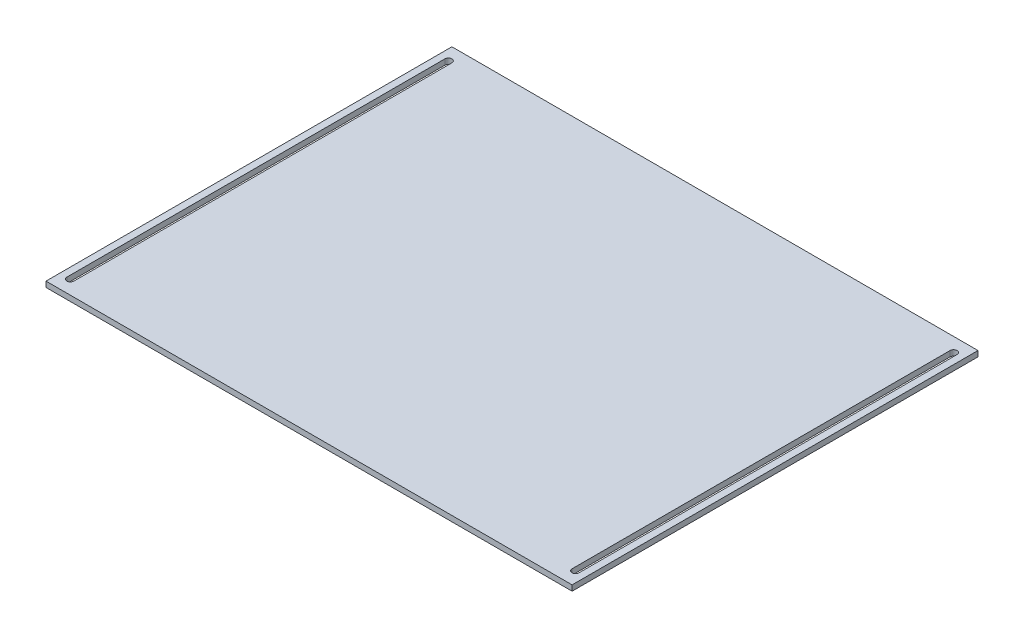
ISO-10303-21;
HEADER;
FILE_DESCRIPTION(('STEP AP214'),'2;1');
FILE_NAME('part.step','',(''),(''),'','','');
FILE_SCHEMA(('AUTOMOTIVE_DESIGN { 1 0 10303 214 1 1 1 1 }'));
ENDSEC;
DATA;
#1=APPLICATION_CONTEXT('core data for automotive mechanical design processes');
#2=APPLICATION_PROTOCOL_DEFINITION('international standard','automotive_design',2000,#1);
#3=PRODUCT_CONTEXT('',#1,'mechanical');
#4=PRODUCT('Part','Part','',(#3));
#5=PRODUCT_RELATED_PRODUCT_CATEGORY('part','',(#4));
#6=PRODUCT_DEFINITION_FORMATION('','',#4);
#7=PRODUCT_DEFINITION_CONTEXT('part definition',#1,'design');
#8=PRODUCT_DEFINITION('design','',#6,#7);
#9=PRODUCT_DEFINITION_SHAPE('','',#8);
#10=(LENGTH_UNIT() NAMED_UNIT(*) SI_UNIT(.MILLI.,.METRE.));
#11=(NAMED_UNIT(*) PLANE_ANGLE_UNIT() SI_UNIT($,.RADIAN.));
#12=(NAMED_UNIT(*) SI_UNIT($,.STERADIAN.) SOLID_ANGLE_UNIT());
#13=UNCERTAINTY_MEASURE_WITH_UNIT(LENGTH_MEASURE(1.E-05),#10,'distance_accuracy_value','');
#14=(GEOMETRIC_REPRESENTATION_CONTEXT(3) GLOBAL_UNCERTAINTY_ASSIGNED_CONTEXT((#13)) GLOBAL_UNIT_ASSIGNED_CONTEXT((#10,
#11,#12)) REPRESENTATION_CONTEXT('',''));
#15=CARTESIAN_POINT('',(0.,0.,0.));
#16=DIRECTION('',(0.,0.,1.));
#17=DIRECTION('',(1.,0.,0.));
#18=AXIS2_PLACEMENT_3D('',#15,#16,#17);
#19=CARTESIAN_POINT('',(0.,3.175,0.));
#20=DIRECTION('',(-1.,0.,0.));
#21=DIRECTION('',(0.,0.,1.));
#22=AXIS2_PLACEMENT_3D('',#19,#20,#21);
#23=PLANE('',#22);
#24=DIRECTION('',(0.,0.,-1.));
#25=VECTOR('',#24,1.);
#26=CARTESIAN_POINT('',(0.,0.,0.));
#27=LINE('',#26,#25);
#28=CARTESIAN_POINT('',(0.,0.,0.));
#29=VERTEX_POINT('',#28);
#30=CARTESIAN_POINT('',(0.,0.,-233.));
#31=VERTEX_POINT('',#30);
#32=EDGE_CURVE('E180',#29,#31,#27,.T.);
#33=ORIENTED_EDGE('',*,*,#32,.T.);
#34=DIRECTION('',(0.,-1.,0.));
#35=VECTOR('',#34,1.);
#36=CARTESIAN_POINT('',(0.,3.175,-233.));
#37=LINE('',#36,#35);
#38=CARTESIAN_POINT('',(0.,3.175,-233.));
#39=VERTEX_POINT('',#38);
#40=EDGE_CURVE('E11',#39,#31,#37,.T.);
#41=ORIENTED_EDGE('',*,*,#40,.F.);
#42=DIRECTION('',(0.,0.,-1.));
#43=VECTOR('',#42,1.);
#44=CARTESIAN_POINT('',(0.,3.175,0.));
#45=LINE('',#44,#43);
#46=CARTESIAN_POINT('',(0.,3.175,0.));
#47=VERTEX_POINT('',#46);
#48=EDGE_CURVE('E228',#47,#39,#45,.T.);
#49=ORIENTED_EDGE('',*,*,#48,.F.);
#50=DIRECTION('',(0.,-1.,0.));
#51=VECTOR('',#50,1.);
#52=CARTESIAN_POINT('',(0.,3.175,0.));
#53=LINE('',#52,#51);
#54=EDGE_CURVE('E242',#47,#29,#53,.T.);
#55=ORIENTED_EDGE('',*,*,#54,.T.);
#56=EDGE_LOOP('',(#33,#41,#49,#55));
#57=FACE_BOUND('',#56,.T.);
#58=ADVANCED_FACE('F45',(#57),#23,.F.);
#59=CARTESIAN_POINT('',(0.,3.175,-233.));
#60=DIRECTION('',(0.,0.,1.));
#61=DIRECTION('',(1.,0.,0.));
#62=AXIS2_PLACEMENT_3D('',#59,#60,#61);
#63=PLANE('',#62);
#64=DIRECTION('',(-1.,0.,0.));
#65=VECTOR('',#64,1.);
#66=CARTESIAN_POINT('',(0.,0.,-233.));
#67=LINE('',#66,#65);
#68=CARTESIAN_POINT('',(-302.,0.,-233.));
#69=VERTEX_POINT('',#68);
#70=EDGE_CURVE('E246',#31,#69,#67,.T.);
#71=ORIENTED_EDGE('',*,*,#70,.T.);
#72=DIRECTION('',(0.,-1.,0.));
#73=VECTOR('',#72,1.);
#74=CARTESIAN_POINT('',(-302.,3.175,-233.));
#75=LINE('',#74,#73);
#76=CARTESIAN_POINT('',(-302.,3.175,-233.));
#77=VERTEX_POINT('',#76);
#78=EDGE_CURVE('E53',#77,#69,#75,.T.);
#79=ORIENTED_EDGE('',*,*,#78,.F.);
#80=DIRECTION('',(-1.,0.,0.));
#81=VECTOR('',#80,1.);
#82=CARTESIAN_POINT('',(0.,3.175,-233.));
#83=LINE('',#82,#81);
#84=EDGE_CURVE('E232',#39,#77,#83,.T.);
#85=ORIENTED_EDGE('',*,*,#84,.F.);
#86=ORIENTED_EDGE('',*,*,#40,.T.);
#87=EDGE_LOOP('',(#71,#79,#85,#86));
#88=FACE_BOUND('',#87,.T.);
#89=ADVANCED_FACE('F281',(#88),#63,.F.);
#90=CARTESIAN_POINT('',(-302.,3.175,0.));
#91=DIRECTION('',(1.,0.,0.));
#92=DIRECTION('',(0.,0.,-1.));
#93=AXIS2_PLACEMENT_3D('',#90,#91,#92);
#94=PLANE('',#93);
#95=DIRECTION('',(0.,0.,1.));
#96=VECTOR('',#95,1.);
#97=CARTESIAN_POINT('',(-302.,0.,0.));
#98=LINE('',#97,#96);
#99=CARTESIAN_POINT('',(-302.,0.,0.));
#100=VERTEX_POINT('',#99);
#101=EDGE_CURVE('E249',#69,#100,#98,.T.);
#102=ORIENTED_EDGE('',*,*,#101,.T.);
#103=DIRECTION('',(0.,-1.,0.));
#104=VECTOR('',#103,1.);
#105=CARTESIAN_POINT('',(-302.,3.175,0.));
#106=LINE('',#105,#104);
#107=CARTESIAN_POINT('',(-302.,3.175,0.));
#108=VERTEX_POINT('',#107);
#109=EDGE_CURVE('E257',#108,#100,#106,.T.);
#110=ORIENTED_EDGE('',*,*,#109,.F.);
#111=DIRECTION('',(0.,0.,1.));
#112=VECTOR('',#111,1.);
#113=CARTESIAN_POINT('',(-302.,3.175,0.));
#114=LINE('',#113,#112);
#115=EDGE_CURVE('E236',#77,#108,#114,.T.);
#116=ORIENTED_EDGE('',*,*,#115,.F.);
#117=ORIENTED_EDGE('',*,*,#78,.T.);
#118=EDGE_LOOP('',(#102,#110,#116,#117));
#119=FACE_BOUND('',#118,.T.);
#120=ADVANCED_FACE('F266',(#119),#94,.F.);
#121=CARTESIAN_POINT('',(0.,3.175,0.));
#122=DIRECTION('',(0.,0.,-1.));
#123=DIRECTION('',(-1.,0.,0.));
#124=AXIS2_PLACEMENT_3D('',#121,#122,#123);
#125=PLANE('',#124);
#126=DIRECTION('',(1.,0.,0.));
#127=VECTOR('',#126,1.);
#128=CARTESIAN_POINT('',(0.,0.,0.));
#129=LINE('',#128,#127);
#130=EDGE_CURVE('E233',#100,#29,#129,.T.);
#131=ORIENTED_EDGE('',*,*,#130,.T.);
#132=ORIENTED_EDGE('',*,*,#54,.F.);
#133=DIRECTION('',(1.,0.,0.));
#134=VECTOR('',#133,1.);
#135=CARTESIAN_POINT('',(0.,3.175,0.));
#136=LINE('',#135,#134);
#137=EDGE_CURVE('E239',#108,#47,#136,.T.);
#138=ORIENTED_EDGE('',*,*,#137,.F.);
#139=ORIENTED_EDGE('',*,*,#109,.T.);
#140=EDGE_LOOP('',(#131,#132,#138,#139));
#141=FACE_BOUND('',#140,.T.);
#142=ADVANCED_FACE('F274',(#141),#125,.F.);
#143=CARTESIAN_POINT('',(0.,3.175,0.));
#144=DIRECTION('',(0.,1.,0.));
#145=DIRECTION('',(0.,0.,1.));
#146=AXIS2_PLACEMENT_3D('',#143,#144,#145);
#147=PLANE('',#146);
#148=CARTESIAN_POINT('',(-296.,3.175,-225.));
#149=DIRECTION('',(0.,1.,0.));
#150=DIRECTION('',(0.,0.,1.));
#151=AXIS2_PLACEMENT_3D('',#148,#149,#150);
#152=CIRCLE('',#151,2.00000000000006);
#153=CARTESIAN_POINT('',(-294.,3.175,-225.));
#154=VERTEX_POINT('',#153);
#155=CARTESIAN_POINT('',(-298.,3.175,-225.));
#156=VERTEX_POINT('',#155);
#157=EDGE_CURVE('E60',#154,#156,#152,.T.);
#158=ORIENTED_EDGE('',*,*,#157,.F.);
#159=DIRECTION('',(0.,0.,-1.));
#160=VECTOR('',#159,1.);
#161=CARTESIAN_POINT('',(-294.,3.175,-225.));
#162=LINE('',#161,#160);
#163=CARTESIAN_POINT('',(-294.,3.175,-8.));
#164=VERTEX_POINT('',#163);
#165=EDGE_CURVE('E158',#164,#154,#162,.T.);
#166=ORIENTED_EDGE('',*,*,#165,.F.);
#167=CARTESIAN_POINT('',(-296.,3.175,-8.));
#168=DIRECTION('',(0.,1.,0.));
#169=DIRECTION('',(0.,0.,1.));
#170=AXIS2_PLACEMENT_3D('',#167,#168,#169);
#171=CIRCLE('',#170,1.99999999999997);
#172=CARTESIAN_POINT('',(-298.,3.175,-8.));
#173=VERTEX_POINT('',#172);
#174=EDGE_CURVE('E162',#173,#164,#171,.T.);
#175=ORIENTED_EDGE('',*,*,#174,.F.);
#176=DIRECTION('',(0.,0.,1.));
#177=VECTOR('',#176,1.);
#178=CARTESIAN_POINT('',(-298.,3.175,-225.));
#179=LINE('',#178,#177);
#180=EDGE_CURVE('E171',#156,#173,#179,.T.);
#181=ORIENTED_EDGE('',*,*,#180,.F.);
#182=EDGE_LOOP('',(#158,#166,#175,#181));
#183=FACE_BOUND('',#182,.T.);
#184=CARTESIAN_POINT('',(-6.,3.175,-225.));
#185=DIRECTION('',(0.,1.,0.));
#186=DIRECTION('',(0.,0.,1.));
#187=AXIS2_PLACEMENT_3D('',#184,#185,#186);
#188=CIRCLE('',#187,2.);
#189=CARTESIAN_POINT('',(-4.,3.175,-225.));
#190=VERTEX_POINT('',#189);
#191=CARTESIAN_POINT('',(-8.,3.175,-225.));
#192=VERTEX_POINT('',#191);
#193=EDGE_CURVE('E68',#190,#192,#188,.T.);
#194=ORIENTED_EDGE('',*,*,#193,.F.);
#195=DIRECTION('',(0.,0.,-1.));
#196=VECTOR('',#195,1.);
#197=CARTESIAN_POINT('',(-4.,3.175,-225.));
#198=LINE('',#197,#196);
#199=CARTESIAN_POINT('',(-3.99999999999997,3.175,-8.00000000000001));
#200=VERTEX_POINT('',#199);
#201=EDGE_CURVE('E199',#200,#190,#198,.T.);
#202=ORIENTED_EDGE('',*,*,#201,.F.);
#203=CARTESIAN_POINT('',(-5.99999999999997,3.175,-8.00000000000001));
#204=DIRECTION('',(0.,1.,0.));
#205=DIRECTION('',(0.,0.,1.));
#206=AXIS2_PLACEMENT_3D('',#203,#204,#205);
#207=CIRCLE('',#206,2.);
#208=CARTESIAN_POINT('',(-7.99999999999997,3.175,-8.00000000000001));
#209=VERTEX_POINT('',#208);
#210=EDGE_CURVE('E203',#209,#200,#207,.T.);
#211=ORIENTED_EDGE('',*,*,#210,.F.);
#212=DIRECTION('',(0.,0.,1.));
#213=VECTOR('',#212,1.);
#214=CARTESIAN_POINT('',(-8.,3.175,-225.));
#215=LINE('',#214,#213);
#216=EDGE_CURVE('E208',#192,#209,#215,.T.);
#217=ORIENTED_EDGE('',*,*,#216,.F.);
#218=EDGE_LOOP('',(#194,#202,#211,#217));
#219=FACE_BOUND('',#218,.T.);
#220=ORIENTED_EDGE('',*,*,#48,.T.);
#221=ORIENTED_EDGE('',*,*,#84,.T.);
#222=ORIENTED_EDGE('',*,*,#115,.T.);
#223=ORIENTED_EDGE('',*,*,#137,.T.);
#224=EDGE_LOOP('',(#220,#221,#222,#223));
#225=FACE_BOUND('',#224,.T.);
#226=ADVANCED_FACE('F280',(#183,#219,#225),#147,.T.);
#227=CARTESIAN_POINT('',(0.,0.,0.));
#228=DIRECTION('',(0.,1.,0.));
#229=DIRECTION('',(0.,0.,1.));
#230=AXIS2_PLACEMENT_3D('',#227,#228,#229);
#231=PLANE('',#230);
#232=DIRECTION('',(0.,0.,-1.));
#233=VECTOR('',#232,1.);
#234=CARTESIAN_POINT('',(-294.,0.,-225.));
#235=LINE('',#234,#233);
#236=CARTESIAN_POINT('',(-294.,0.,-8.));
#237=VERTEX_POINT('',#236);
#238=CARTESIAN_POINT('',(-294.,0.,-225.));
#239=VERTEX_POINT('',#238);
#240=EDGE_CURVE('E143',#237,#239,#235,.T.);
#241=ORIENTED_EDGE('',*,*,#240,.T.);
#242=CARTESIAN_POINT('',(-296.,0.,-225.));
#243=DIRECTION('',(0.,1.,0.));
#244=DIRECTION('',(0.,0.,1.));
#245=AXIS2_PLACEMENT_3D('',#242,#243,#244);
#246=CIRCLE('',#245,2.00000000000006);
#247=CARTESIAN_POINT('',(-298.,0.,-225.));
#248=VERTEX_POINT('',#247);
#249=EDGE_CURVE('E136',#239,#248,#246,.T.);
#250=ORIENTED_EDGE('',*,*,#249,.T.);
#251=DIRECTION('',(0.,0.,1.));
#252=VECTOR('',#251,1.);
#253=CARTESIAN_POINT('',(-298.,0.,-225.));
#254=LINE('',#253,#252);
#255=CARTESIAN_POINT('',(-298.,0.,-8.));
#256=VERTEX_POINT('',#255);
#257=EDGE_CURVE('E147',#248,#256,#254,.T.);
#258=ORIENTED_EDGE('',*,*,#257,.T.);
#259=CARTESIAN_POINT('',(-296.,0.,-8.));
#260=DIRECTION('',(0.,1.,0.));
#261=DIRECTION('',(0.,0.,1.));
#262=AXIS2_PLACEMENT_3D('',#259,#260,#261);
#263=CIRCLE('',#262,1.99999999999997);
#264=EDGE_CURVE('E152',#256,#237,#263,.T.);
#265=ORIENTED_EDGE('',*,*,#264,.T.);
#266=EDGE_LOOP('',(#241,#250,#258,#265));
#267=FACE_BOUND('',#266,.T.);
#268=DIRECTION('',(0.,0.,-1.));
#269=VECTOR('',#268,1.);
#270=CARTESIAN_POINT('',(-4.,0.,-225.));
#271=LINE('',#270,#269);
#272=CARTESIAN_POINT('',(-3.99999999999997,0.,-8.00000000000001));
#273=VERTEX_POINT('',#272);
#274=CARTESIAN_POINT('',(-4.,0.,-225.));
#275=VERTEX_POINT('',#274);
#276=EDGE_CURVE('E189',#273,#275,#271,.T.);
#277=ORIENTED_EDGE('',*,*,#276,.T.);
#278=CARTESIAN_POINT('',(-6.,0.,-225.));
#279=DIRECTION('',(0.,1.,0.));
#280=DIRECTION('',(0.,0.,1.));
#281=AXIS2_PLACEMENT_3D('',#278,#279,#280);
#282=CIRCLE('',#281,2.);
#283=CARTESIAN_POINT('',(-8.,0.,-225.));
#284=VERTEX_POINT('',#283);
#285=EDGE_CURVE('E204',#275,#284,#282,.T.);
#286=ORIENTED_EDGE('',*,*,#285,.T.);
#287=DIRECTION('',(0.,0.,1.));
#288=VECTOR('',#287,1.);
#289=CARTESIAN_POINT('',(-8.,0.,-225.));
#290=LINE('',#289,#288);
#291=CARTESIAN_POINT('',(-7.99999999999997,0.,-8.00000000000001));
#292=VERTEX_POINT('',#291);
#293=EDGE_CURVE('E221',#284,#292,#290,.T.);
#294=ORIENTED_EDGE('',*,*,#293,.T.);
#295=CARTESIAN_POINT('',(-5.99999999999997,0.,-8.00000000000001));
#296=DIRECTION('',(0.,1.,0.));
#297=DIRECTION('',(0.,0.,1.));
#298=AXIS2_PLACEMENT_3D('',#295,#296,#297);
#299=CIRCLE('',#298,2.);
#300=EDGE_CURVE('E217',#292,#273,#299,.T.);
#301=ORIENTED_EDGE('',*,*,#300,.T.);
#302=EDGE_LOOP('',(#277,#286,#294,#301));
#303=FACE_BOUND('',#302,.T.);
#304=ORIENTED_EDGE('',*,*,#32,.F.);
#305=ORIENTED_EDGE('',*,*,#130,.F.);
#306=ORIENTED_EDGE('',*,*,#101,.F.);
#307=ORIENTED_EDGE('',*,*,#70,.F.);
#308=EDGE_LOOP('',(#304,#305,#306,#307));
#309=FACE_BOUND('',#308,.T.);
#310=ADVANCED_FACE('F154',(#267,#303,#309),#231,.F.);
#311=CARTESIAN_POINT('',(-6.,0.,-225.));
#312=DIRECTION('',(0.,1.,0.));
#313=DIRECTION('',(0.,0.,1.));
#314=AXIS2_PLACEMENT_3D('',#311,#312,#313);
#315=CYLINDRICAL_SURFACE('',#314,2.);
#316=ORIENTED_EDGE('',*,*,#193,.T.);
#317=DIRECTION('',(0.,1.,0.));
#318=VECTOR('',#317,1.);
#319=CARTESIAN_POINT('',(-8.,0.,-225.));
#320=LINE('',#319,#318);
#321=EDGE_CURVE('E186',#284,#192,#320,.T.);
#322=ORIENTED_EDGE('',*,*,#321,.F.);
#323=ORIENTED_EDGE('',*,*,#285,.F.);
#324=DIRECTION('',(0.,1.,0.));
#325=VECTOR('',#324,1.);
#326=CARTESIAN_POINT('',(-4.,0.,-225.));
#327=LINE('',#326,#325);
#328=EDGE_CURVE('E196',#275,#190,#327,.T.);
#329=ORIENTED_EDGE('',*,*,#328,.T.);
#330=EDGE_LOOP('',(#316,#322,#323,#329));
#331=FACE_BOUND('',#330,.T.);
#332=ADVANCED_FACE('F293',(#331),#315,.F.);
#333=CARTESIAN_POINT('',(-4.,0.,-225.));
#334=DIRECTION('',(1.,0.,0.));
#335=DIRECTION('',(0.,0.,-1.));
#336=AXIS2_PLACEMENT_3D('',#333,#334,#335);
#337=PLANE('',#336);
#338=ORIENTED_EDGE('',*,*,#201,.T.);
#339=ORIENTED_EDGE('',*,*,#328,.F.);
#340=ORIENTED_EDGE('',*,*,#276,.F.);
#341=DIRECTION('',(0.,1.,0.));
#342=VECTOR('',#341,1.);
#343=CARTESIAN_POINT('',(-3.99999999999997,0.,-8.00000000000001));
#344=LINE('',#343,#342);
#345=EDGE_CURVE('E193',#273,#200,#344,.T.);
#346=ORIENTED_EDGE('',*,*,#345,.T.);
#347=EDGE_LOOP('',(#338,#339,#340,#346));
#348=FACE_BOUND('',#347,.T.);
#349=ADVANCED_FACE('F297',(#348),#337,.F.);
#350=CARTESIAN_POINT('',(-5.99999999999997,0.,-8.00000000000001));
#351=DIRECTION('',(0.,1.,0.));
#352=DIRECTION('',(0.,0.,1.));
#353=AXIS2_PLACEMENT_3D('',#350,#351,#352);
#354=CYLINDRICAL_SURFACE('',#353,2.);
#355=ORIENTED_EDGE('',*,*,#210,.T.);
#356=ORIENTED_EDGE('',*,*,#345,.F.);
#357=ORIENTED_EDGE('',*,*,#300,.F.);
#358=DIRECTION('',(0.,1.,0.));
#359=VECTOR('',#358,1.);
#360=CARTESIAN_POINT('',(-7.99999999999997,0.,-8.00000000000001));
#361=LINE('',#360,#359);
#362=EDGE_CURVE('E190',#292,#209,#361,.T.);
#363=ORIENTED_EDGE('',*,*,#362,.T.);
#364=EDGE_LOOP('',(#355,#356,#357,#363));
#365=FACE_BOUND('',#364,.T.);
#366=ADVANCED_FACE('F300',(#365),#354,.F.);
#367=CARTESIAN_POINT('',(-8.,0.,-225.));
#368=DIRECTION('',(-1.,0.,0.));
#369=DIRECTION('',(0.,0.,1.));
#370=AXIS2_PLACEMENT_3D('',#367,#368,#369);
#371=PLANE('',#370);
#372=ORIENTED_EDGE('',*,*,#216,.T.);
#373=ORIENTED_EDGE('',*,*,#362,.F.);
#374=ORIENTED_EDGE('',*,*,#293,.F.);
#375=ORIENTED_EDGE('',*,*,#321,.T.);
#376=EDGE_LOOP('',(#372,#373,#374,#375));
#377=FACE_BOUND('',#376,.T.);
#378=ADVANCED_FACE('F304',(#377),#371,.F.);
#379=CARTESIAN_POINT('',(-296.,0.,-225.));
#380=DIRECTION('',(0.,1.,0.));
#381=DIRECTION('',(0.,0.,1.));
#382=AXIS2_PLACEMENT_3D('',#379,#380,#381);
#383=CYLINDRICAL_SURFACE('',#382,2.00000000000006);
#384=ORIENTED_EDGE('',*,*,#157,.T.);
#385=DIRECTION('',(0.,1.,0.));
#386=VECTOR('',#385,1.);
#387=CARTESIAN_POINT('',(-298.,0.,-225.));
#388=LINE('',#387,#386);
#389=EDGE_CURVE('E132',#248,#156,#388,.T.);
#390=ORIENTED_EDGE('',*,*,#389,.F.);
#391=ORIENTED_EDGE('',*,*,#249,.F.);
#392=DIRECTION('',(0.,1.,0.));
#393=VECTOR('',#392,1.);
#394=CARTESIAN_POINT('',(-294.,0.,-225.));
#395=LINE('',#394,#393);
#396=EDGE_CURVE('E177',#239,#154,#395,.T.);
#397=ORIENTED_EDGE('',*,*,#396,.T.);
#398=EDGE_LOOP('',(#384,#390,#391,#397));
#399=FACE_BOUND('',#398,.T.);
#400=ADVANCED_FACE('F134',(#399),#383,.F.);
#401=CARTESIAN_POINT('',(-294.,0.,-225.));
#402=DIRECTION('',(1.,0.,0.));
#403=DIRECTION('',(0.,0.,-1.));
#404=AXIS2_PLACEMENT_3D('',#401,#402,#403);
#405=PLANE('',#404);
#406=ORIENTED_EDGE('',*,*,#165,.T.);
#407=ORIENTED_EDGE('',*,*,#396,.F.);
#408=ORIENTED_EDGE('',*,*,#240,.F.);
#409=DIRECTION('',(0.,1.,0.));
#410=VECTOR('',#409,1.);
#411=CARTESIAN_POINT('',(-294.,0.,-8.));
#412=LINE('',#411,#410);
#413=EDGE_CURVE('E181',#237,#164,#412,.T.);
#414=ORIENTED_EDGE('',*,*,#413,.T.);
#415=EDGE_LOOP('',(#406,#407,#408,#414));
#416=FACE_BOUND('',#415,.T.);
#417=ADVANCED_FACE('F313',(#416),#405,.F.);
#418=CARTESIAN_POINT('',(-296.,0.,-8.));
#419=DIRECTION('',(0.,1.,0.));
#420=DIRECTION('',(0.,0.,1.));
#421=AXIS2_PLACEMENT_3D('',#418,#419,#420);
#422=CYLINDRICAL_SURFACE('',#421,1.99999999999997);
#423=ORIENTED_EDGE('',*,*,#174,.T.);
#424=ORIENTED_EDGE('',*,*,#413,.F.);
#425=ORIENTED_EDGE('',*,*,#264,.F.);
#426=DIRECTION('',(0.,1.,0.));
#427=VECTOR('',#426,1.);
#428=CARTESIAN_POINT('',(-298.,0.,-8.));
#429=LINE('',#428,#427);
#430=EDGE_CURVE('E142',#256,#173,#429,.T.);
#431=ORIENTED_EDGE('',*,*,#430,.T.);
#432=EDGE_LOOP('',(#423,#424,#425,#431));
#433=FACE_BOUND('',#432,.T.);
#434=ADVANCED_FACE('F316',(#433),#422,.F.);
#435=CARTESIAN_POINT('',(-298.,0.,-225.));
#436=DIRECTION('',(-1.,0.,0.));
#437=DIRECTION('',(0.,0.,1.));
#438=AXIS2_PLACEMENT_3D('',#435,#436,#437);
#439=PLANE('',#438);
#440=ORIENTED_EDGE('',*,*,#180,.T.);
#441=ORIENTED_EDGE('',*,*,#430,.F.);
#442=ORIENTED_EDGE('',*,*,#257,.F.);
#443=ORIENTED_EDGE('',*,*,#389,.T.);
#444=EDGE_LOOP('',(#440,#441,#442,#443));
#445=FACE_BOUND('',#444,.T.);
#446=ADVANCED_FACE('F148',(#445),#439,.F.);
#447=CLOSED_SHELL('',(#58,#89,#120,#142,#226,#310,#332,#349,#366,#378,#400,#417,#434,#446));
#448=MANIFOLD_SOLID_BREP('B2',#447);
#449=ADVANCED_BREP_SHAPE_REPRESENTATION('',(#18,#448),#14);
#450=SHAPE_DEFINITION_REPRESENTATION(#9,#449);
ENDSEC;
END-ISO-10303-21;
